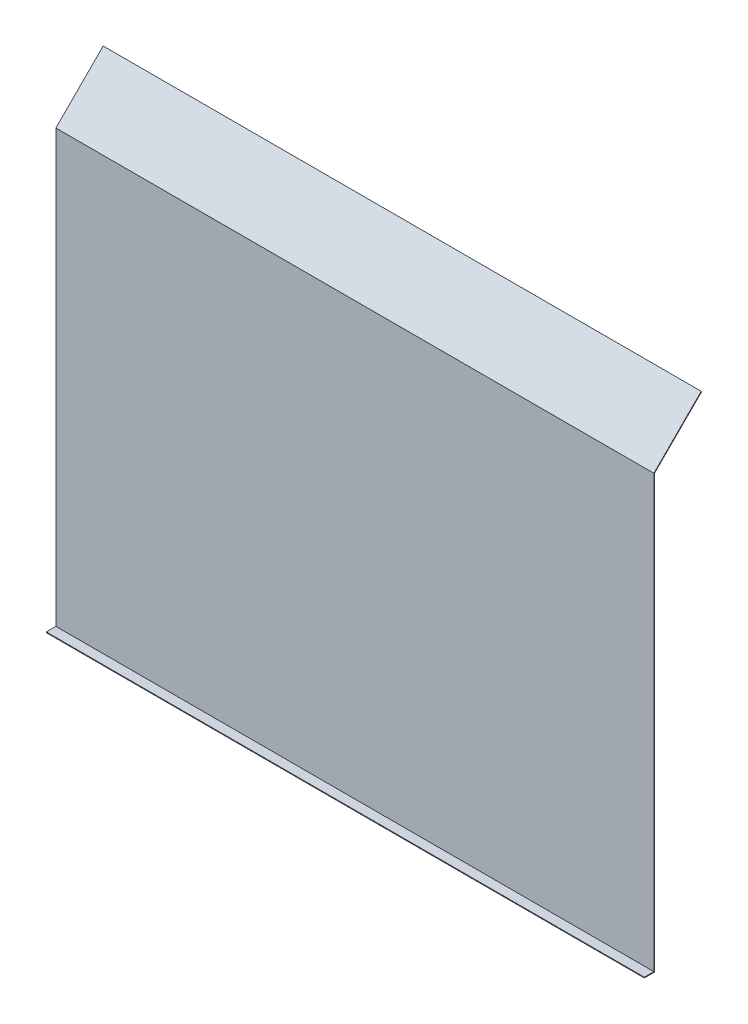
ISO-10303-21;
HEADER;
FILE_DESCRIPTION(('STEP AP214'),'2;1');
FILE_NAME('part.step','',(''),(''),'','','');
FILE_SCHEMA(('AUTOMOTIVE_DESIGN { 1 0 10303 214 1 1 1 1 }'));
ENDSEC;
DATA;
#1=APPLICATION_CONTEXT('core data for automotive mechanical design processes');
#2=APPLICATION_PROTOCOL_DEFINITION('international standard','automotive_design',2000,#1);
#3=PRODUCT_CONTEXT('',#1,'mechanical');
#4=PRODUCT('Part','Part','',(#3));
#5=PRODUCT_RELATED_PRODUCT_CATEGORY('part','',(#4));
#6=PRODUCT_DEFINITION_FORMATION('','',#4);
#7=PRODUCT_DEFINITION_CONTEXT('part definition',#1,'design');
#8=PRODUCT_DEFINITION('design','',#6,#7);
#9=PRODUCT_DEFINITION_SHAPE('','',#8);
#10=(LENGTH_UNIT() NAMED_UNIT(*) SI_UNIT(.MILLI.,.METRE.));
#11=(NAMED_UNIT(*) PLANE_ANGLE_UNIT() SI_UNIT($,.RADIAN.));
#12=(NAMED_UNIT(*) SI_UNIT($,.STERADIAN.) SOLID_ANGLE_UNIT());
#13=UNCERTAINTY_MEASURE_WITH_UNIT(LENGTH_MEASURE(1.E-05),#10,'distance_accuracy_value','');
#14=(GEOMETRIC_REPRESENTATION_CONTEXT(3) GLOBAL_UNCERTAINTY_ASSIGNED_CONTEXT((#13)) GLOBAL_UNIT_ASSIGNED_CONTEXT((#10,
#11,#12)) REPRESENTATION_CONTEXT('',''));
#15=CARTESIAN_POINT('',(0.,0.,0.));
#16=DIRECTION('',(0.,0.,1.));
#17=DIRECTION('',(1.,0.,0.));
#18=AXIS2_PLACEMENT_3D('',#15,#16,#17);
#19=CARTESIAN_POINT('',(1250.,507.466457498209,-27.0771642945663));
#20=DIRECTION('',(1.,0.,0.));
#21=DIRECTION('',(0.,1.,0.));
#22=AXIS2_PLACEMENT_3D('',#19,#20,#21);
#23=PLANE('',#22);
#24=DIRECTION('',(0.,0.,1.));
#25=VECTOR('',#24,1.);
#26=CARTESIAN_POINT('',(1250.,0.,0.));
#27=LINE('',#26,#25);
#28=CARTESIAN_POINT('',(1250.,0.,-20.));
#29=VERTEX_POINT('',#28);
#30=CARTESIAN_POINT('',(1250.,0.,0.));
#31=VERTEX_POINT('',#30);
#32=EDGE_CURVE('E11',#29,#31,#27,.T.);
#33=ORIENTED_EDGE('',*,*,#32,.T.);
#34=DIRECTION('',(0.,-1.,0.));
#35=VECTOR('',#34,1.);
#36=CARTESIAN_POINT('',(1250.,-1.5,0.));
#37=LINE('',#36,#35);
#38=CARTESIAN_POINT('',(1250.,-1.5,0.));
#39=VERTEX_POINT('',#38);
#40=EDGE_CURVE('E162',#31,#39,#37,.T.);
#41=ORIENTED_EDGE('',*,*,#40,.T.);
#42=DIRECTION('',(0.,0.,-1.));
#43=VECTOR('',#42,1.);
#44=CARTESIAN_POINT('',(1250.,-1.49999999999998,-21.5));
#45=LINE('',#44,#43);
#46=CARTESIAN_POINT('',(1250.,-1.49999999999998,-21.5));
#47=VERTEX_POINT('',#46);
#48=EDGE_CURVE('E158',#39,#47,#45,.T.);
#49=ORIENTED_EDGE('',*,*,#48,.T.);
#50=DIRECTION('',(0.,1.,0.));
#51=VECTOR('',#50,1.);
#52=CARTESIAN_POINT('',(1250.,300.62132034356,-21.5));
#53=LINE('',#52,#51);
#54=CARTESIAN_POINT('',(1250.,901.5,-21.4999999999997));
#55=VERTEX_POINT('',#54);
#56=EDGE_CURVE('E145',#47,#55,#53,.T.);
#57=ORIENTED_EDGE('',*,*,#56,.T.);
#58=DIRECTION('',(0.,0.707106781186548,-0.707106781186547));
#59=VECTOR('',#58,1.);
#60=CARTESIAN_POINT('',(1250.,1000.,-120.));
#61=LINE('',#60,#59);
#62=CARTESIAN_POINT('',(1250.,1000.,-120.));
#63=VERTEX_POINT('',#62);
#64=EDGE_CURVE('E170',#55,#63,#61,.T.);
#65=ORIENTED_EDGE('',*,*,#64,.T.);
#66=DIRECTION('',(0.,0.707106781186553,0.707106781186542));
#67=VECTOR('',#66,1.);
#68=CARTESIAN_POINT('',(1250.,1001.06066017178,-118.93933982822));
#69=LINE('',#68,#67);
#70=CARTESIAN_POINT('',(1250.,1001.06066017178,-118.93933982822));
#71=VERTEX_POINT('',#70);
#72=EDGE_CURVE('E128',#63,#71,#69,.T.);
#73=ORIENTED_EDGE('',*,*,#72,.T.);
#74=DIRECTION('',(0.,-0.707106781186548,0.707106781186547));
#75=VECTOR('',#74,1.);
#76=CARTESIAN_POINT('',(1250.,902.121320343559,-19.9999999999997));
#77=LINE('',#76,#75);
#78=CARTESIAN_POINT('',(1250.,902.121320343559,-19.9999999999997));
#79=VERTEX_POINT('',#78);
#80=EDGE_CURVE('E148',#71,#79,#77,.T.);
#81=ORIENTED_EDGE('',*,*,#80,.T.);
#82=DIRECTION('',(0.,-1.,0.));
#83=VECTOR('',#82,1.);
#84=CARTESIAN_POINT('',(1250.,450.,-20.));
#85=LINE('',#84,#83);
#86=EDGE_CURVE('E115',#79,#29,#85,.T.);
#87=ORIENTED_EDGE('',*,*,#86,.T.);
#88=EDGE_LOOP('',(#33,#41,#49,#57,#65,#73,#81,#87));
#89=FACE_BOUND('',#88,.T.);
#90=ADVANCED_FACE('F17',(#89),#23,.T.);
#91=CARTESIAN_POINT('',(0.,507.466457498209,-27.0771642945663));
#92=DIRECTION('',(1.,0.,0.));
#93=DIRECTION('',(0.,1.,0.));
#94=AXIS2_PLACEMENT_3D('',#91,#92,#93);
#95=PLANE('',#94);
#96=DIRECTION('',(0.,0.,-1.));
#97=VECTOR('',#96,1.);
#98=CARTESIAN_POINT('',(0.,0.,0.));
#99=LINE('',#98,#97);
#100=CARTESIAN_POINT('',(0.,0.,0.));
#101=VERTEX_POINT('',#100);
#102=CARTESIAN_POINT('',(0.,0.,-20.));
#103=VERTEX_POINT('',#102);
#104=EDGE_CURVE('E21',#101,#103,#99,.T.);
#105=ORIENTED_EDGE('',*,*,#104,.T.);
#106=DIRECTION('',(0.,1.,0.));
#107=VECTOR('',#106,1.);
#108=CARTESIAN_POINT('',(0.,0.,-20.));
#109=LINE('',#108,#107);
#110=CARTESIAN_POINT('',(0.,902.121320343559,-19.9999999999997));
#111=VERTEX_POINT('',#110);
#112=EDGE_CURVE('E102',#103,#111,#109,.T.);
#113=ORIENTED_EDGE('',*,*,#112,.T.);
#114=DIRECTION('',(0.,0.707106781186548,-0.707106781186547));
#115=VECTOR('',#114,1.);
#116=CARTESIAN_POINT('',(0.,902.121320343559,-19.9999999999997));
#117=LINE('',#116,#115);
#118=CARTESIAN_POINT('',(0.,1001.06066017178,-118.93933982822));
#119=VERTEX_POINT('',#118);
#120=EDGE_CURVE('E152',#111,#119,#117,.T.);
#121=ORIENTED_EDGE('',*,*,#120,.T.);
#122=DIRECTION('',(0.,-0.707106781186553,-0.707106781186542));
#123=VECTOR('',#122,1.);
#124=CARTESIAN_POINT('',(0.,1001.06066017178,-118.93933982822));
#125=LINE('',#124,#123);
#126=CARTESIAN_POINT('',(0.,1000.,-120.));
#127=VERTEX_POINT('',#126);
#128=EDGE_CURVE('E130',#119,#127,#125,.T.);
#129=ORIENTED_EDGE('',*,*,#128,.T.);
#130=DIRECTION('',(0.,-0.707106781186548,0.707106781186547));
#131=VECTOR('',#130,1.);
#132=CARTESIAN_POINT('',(0.,1000.,-120.));
#133=LINE('',#132,#131);
#134=CARTESIAN_POINT('',(0.,901.5,-21.4999999999997));
#135=VERTEX_POINT('',#134);
#136=EDGE_CURVE('E139',#127,#135,#133,.T.);
#137=ORIENTED_EDGE('',*,*,#136,.T.);
#138=DIRECTION('',(0.,-1.,0.));
#139=VECTOR('',#138,1.);
#140=CARTESIAN_POINT('',(0.,901.5,-21.4999999999997));
#141=LINE('',#140,#139);
#142=CARTESIAN_POINT('',(0.,-1.49999999999998,-21.5));
#143=VERTEX_POINT('',#142);
#144=EDGE_CURVE('E155',#135,#143,#141,.T.);
#145=ORIENTED_EDGE('',*,*,#144,.T.);
#146=DIRECTION('',(0.,0.,1.));
#147=VECTOR('',#146,1.);
#148=CARTESIAN_POINT('',(0.,-1.49999999999998,-21.5));
#149=LINE('',#148,#147);
#150=CARTESIAN_POINT('',(0.,-1.5,0.));
#151=VERTEX_POINT('',#150);
#152=EDGE_CURVE('E144',#143,#151,#149,.T.);
#153=ORIENTED_EDGE('',*,*,#152,.T.);
#154=DIRECTION('',(0.,1.,0.));
#155=VECTOR('',#154,1.);
#156=CARTESIAN_POINT('',(0.,-1.5,0.));
#157=LINE('',#156,#155);
#158=EDGE_CURVE('E104',#151,#101,#157,.T.);
#159=ORIENTED_EDGE('',*,*,#158,.T.);
#160=EDGE_LOOP('',(#105,#113,#121,#129,#137,#145,#153,#159));
#161=FACE_BOUND('',#160,.T.);
#162=ADVANCED_FACE('F99',(#161),#95,.F.);
#163=CARTESIAN_POINT('',(0.,0.,-20.));
#164=DIRECTION('',(0.,1.,0.));
#165=DIRECTION('',(0.,0.,-1.));
#166=AXIS2_PLACEMENT_3D('',#163,#164,#165);
#167=PLANE('',#166);
#168=ORIENTED_EDGE('',*,*,#104,.F.);
#169=DIRECTION('',(1.,0.,0.));
#170=VECTOR('',#169,1.);
#171=CARTESIAN_POINT('',(0.,0.,0.));
#172=LINE('',#171,#170);
#173=EDGE_CURVE('E108',#101,#31,#172,.T.);
#174=ORIENTED_EDGE('',*,*,#173,.T.);
#175=ORIENTED_EDGE('',*,*,#32,.F.);
#176=DIRECTION('',(1.,0.,0.));
#177=VECTOR('',#176,1.);
#178=CARTESIAN_POINT('',(0.,0.,-20.));
#179=LINE('',#178,#177);
#180=EDGE_CURVE('E110',#103,#29,#179,.T.);
#181=ORIENTED_EDGE('',*,*,#180,.F.);
#182=EDGE_LOOP('',(#168,#174,#175,#181));
#183=FACE_BOUND('',#182,.T.);
#184=ADVANCED_FACE('F111',(#183),#167,.T.);
#185=CARTESIAN_POINT('',(0.,0.,0.));
#186=DIRECTION('',(0.,0.,1.));
#187=DIRECTION('',(0.,-1.,0.));
#188=AXIS2_PLACEMENT_3D('',#185,#186,#187);
#189=PLANE('',#188);
#190=ORIENTED_EDGE('',*,*,#158,.F.);
#191=DIRECTION('',(1.,0.,0.));
#192=VECTOR('',#191,1.);
#193=CARTESIAN_POINT('',(0.,-1.5,0.));
#194=LINE('',#193,#192);
#195=EDGE_CURVE('E161',#151,#39,#194,.T.);
#196=ORIENTED_EDGE('',*,*,#195,.T.);
#197=ORIENTED_EDGE('',*,*,#40,.F.);
#198=ORIENTED_EDGE('',*,*,#173,.F.);
#199=EDGE_LOOP('',(#190,#196,#197,#198));
#200=FACE_BOUND('',#199,.T.);
#201=ADVANCED_FACE('F217',(#200),#189,.T.);
#202=CARTESIAN_POINT('',(0.,-1.5,0.));
#203=DIRECTION('',(0.,-1.,0.));
#204=DIRECTION('',(0.,0.,-1.));
#205=AXIS2_PLACEMENT_3D('',#202,#203,#204);
#206=PLANE('',#205);
#207=ORIENTED_EDGE('',*,*,#152,.F.);
#208=DIRECTION('',(1.,0.,0.));
#209=VECTOR('',#208,1.);
#210=CARTESIAN_POINT('',(0.,-1.49999999999998,-21.5));
#211=LINE('',#210,#209);
#212=EDGE_CURVE('E140',#143,#47,#211,.T.);
#213=ORIENTED_EDGE('',*,*,#212,.T.);
#214=ORIENTED_EDGE('',*,*,#48,.F.);
#215=ORIENTED_EDGE('',*,*,#195,.F.);
#216=EDGE_LOOP('',(#207,#213,#214,#215));
#217=FACE_BOUND('',#216,.T.);
#218=ADVANCED_FACE('F213',(#217),#206,.T.);
#219=CARTESIAN_POINT('',(0.,-1.5,-21.5));
#220=DIRECTION('',(0.,0.,-1.));
#221=DIRECTION('',(-1.,0.,0.));
#222=AXIS2_PLACEMENT_3D('',#219,#220,#221);
#223=PLANE('',#222);
#224=ORIENTED_EDGE('',*,*,#144,.F.);
#225=DIRECTION('',(1.,0.,0.));
#226=VECTOR('',#225,1.);
#227=CARTESIAN_POINT('',(0.,901.5,-21.4999999999997));
#228=LINE('',#227,#226);
#229=EDGE_CURVE('E179',#135,#55,#228,.T.);
#230=ORIENTED_EDGE('',*,*,#229,.T.);
#231=ORIENTED_EDGE('',*,*,#56,.F.);
#232=ORIENTED_EDGE('',*,*,#212,.F.);
#233=EDGE_LOOP('',(#224,#230,#231,#232));
#234=FACE_BOUND('',#233,.T.);
#235=ADVANCED_FACE('F19',(#234),#223,.T.);
#236=CARTESIAN_POINT('',(0.,901.5,-21.4999999999997));
#237=DIRECTION('',(0.,-0.707106781186547,-0.707106781186548));
#238=DIRECTION('',(0.,-0.707106781186548,0.707106781186547));
#239=AXIS2_PLACEMENT_3D('',#236,#237,#238);
#240=PLANE('',#239);
#241=ORIENTED_EDGE('',*,*,#136,.F.);
#242=DIRECTION('',(1.,0.,0.));
#243=VECTOR('',#242,1.);
#244=CARTESIAN_POINT('',(0.,1000.,-120.));
#245=LINE('',#244,#243);
#246=EDGE_CURVE('E135',#127,#63,#245,.T.);
#247=ORIENTED_EDGE('',*,*,#246,.T.);
#248=ORIENTED_EDGE('',*,*,#64,.F.);
#249=ORIENTED_EDGE('',*,*,#229,.F.);
#250=EDGE_LOOP('',(#241,#247,#248,#249));
#251=FACE_BOUND('',#250,.T.);
#252=ADVANCED_FACE('F209',(#251),#240,.T.);
#253=CARTESIAN_POINT('',(0.,1000.,-120.));
#254=DIRECTION('',(0.,0.707106781186542,-0.707106781186554));
#255=DIRECTION('',(-1.,0.,0.));
#256=AXIS2_PLACEMENT_3D('',#253,#254,#255);
#257=PLANE('',#256);
#258=ORIENTED_EDGE('',*,*,#128,.F.);
#259=DIRECTION('',(1.,0.,0.));
#260=VECTOR('',#259,1.);
#261=CARTESIAN_POINT('',(0.,1001.06066017178,-118.93933982822));
#262=LINE('',#261,#260);
#263=EDGE_CURVE('E134',#119,#71,#262,.T.);
#264=ORIENTED_EDGE('',*,*,#263,.T.);
#265=ORIENTED_EDGE('',*,*,#72,.F.);
#266=ORIENTED_EDGE('',*,*,#246,.F.);
#267=EDGE_LOOP('',(#258,#264,#265,#266));
#268=FACE_BOUND('',#267,.T.);
#269=ADVANCED_FACE('F207',(#268),#257,.T.);
#270=CARTESIAN_POINT('',(0.,1001.06066017178,-118.93933982822));
#271=DIRECTION('',(0.,0.707106781186547,0.707106781186548));
#272=DIRECTION('',(1.,0.,0.));
#273=AXIS2_PLACEMENT_3D('',#270,#271,#272);
#274=PLANE('',#273);
#275=ORIENTED_EDGE('',*,*,#120,.F.);
#276=DIRECTION('',(1.,0.,0.));
#277=VECTOR('',#276,1.);
#278=CARTESIAN_POINT('',(0.,902.121320343559,-19.9999999999997));
#279=LINE('',#278,#277);
#280=EDGE_CURVE('E120',#111,#79,#279,.T.);
#281=ORIENTED_EDGE('',*,*,#280,.T.);
#282=ORIENTED_EDGE('',*,*,#80,.F.);
#283=ORIENTED_EDGE('',*,*,#263,.F.);
#284=EDGE_LOOP('',(#275,#281,#282,#283));
#285=FACE_BOUND('',#284,.T.);
#286=ADVANCED_FACE('F204',(#285),#274,.T.);
#287=CARTESIAN_POINT('',(0.,902.121320343559,-19.9999999999997));
#288=DIRECTION('',(0.,0.,1.));
#289=DIRECTION('',(0.,-1.,0.));
#290=AXIS2_PLACEMENT_3D('',#287,#288,#289);
#291=PLANE('',#290);
#292=ORIENTED_EDGE('',*,*,#112,.F.);
#293=ORIENTED_EDGE('',*,*,#180,.T.);
#294=ORIENTED_EDGE('',*,*,#86,.F.);
#295=ORIENTED_EDGE('',*,*,#280,.F.);
#296=EDGE_LOOP('',(#292,#293,#294,#295));
#297=FACE_BOUND('',#296,.T.);
#298=ADVANCED_FACE('F118',(#297),#291,.T.);
#299=CLOSED_SHELL('',(#90,#162,#184,#201,#218,#235,#252,#269,#286,#298));
#300=MANIFOLD_SOLID_BREP('B1',#299);
#301=ADVANCED_BREP_SHAPE_REPRESENTATION('',(#18,#300),#14);
#302=SHAPE_DEFINITION_REPRESENTATION(#9,#301);
ENDSEC;
END-ISO-10303-21;
